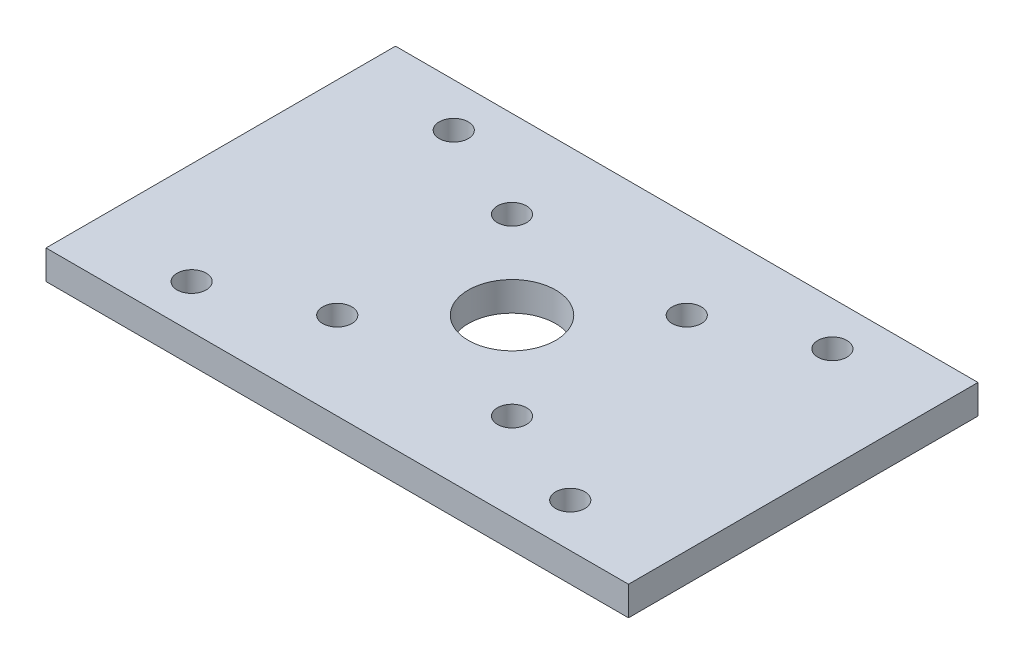
ISO-10303-21;
HEADER;
FILE_DESCRIPTION(('STEP AP214'),'2;1');
FILE_NAME('part.step','',(''),(''),'','','');
FILE_SCHEMA(('AUTOMOTIVE_DESIGN { 1 0 10303 214 1 1 1 1 }'));
ENDSEC;
DATA;
#1=APPLICATION_CONTEXT('core data for automotive mechanical design processes');
#2=APPLICATION_PROTOCOL_DEFINITION('international standard','automotive_design',2000,#1);
#3=PRODUCT_CONTEXT('',#1,'mechanical');
#4=PRODUCT('Part','Part','',(#3));
#5=PRODUCT_RELATED_PRODUCT_CATEGORY('part','',(#4));
#6=PRODUCT_DEFINITION_FORMATION('','',#4);
#7=PRODUCT_DEFINITION_CONTEXT('part definition',#1,'design');
#8=PRODUCT_DEFINITION('design','',#6,#7);
#9=PRODUCT_DEFINITION_SHAPE('','',#8);
#10=(LENGTH_UNIT() NAMED_UNIT(*) SI_UNIT(.MILLI.,.METRE.));
#11=(NAMED_UNIT(*) PLANE_ANGLE_UNIT() SI_UNIT($,.RADIAN.));
#12=(NAMED_UNIT(*) SI_UNIT($,.STERADIAN.) SOLID_ANGLE_UNIT());
#13=UNCERTAINTY_MEASURE_WITH_UNIT(LENGTH_MEASURE(1.E-05),#10,'distance_accuracy_value','');
#14=(GEOMETRIC_REPRESENTATION_CONTEXT(3) GLOBAL_UNCERTAINTY_ASSIGNED_CONTEXT((#13)) GLOBAL_UNIT_ASSIGNED_CONTEXT((#10,
#11,#12)) REPRESENTATION_CONTEXT('',''));
#15=CARTESIAN_POINT('',(0.,0.,0.));
#16=DIRECTION('',(0.,0.,1.));
#17=DIRECTION('',(1.,0.,0.));
#18=AXIS2_PLACEMENT_3D('',#15,#16,#17);
#19=CARTESIAN_POINT('',(63.5,6.35,38.1));
#20=DIRECTION('',(-1.,0.,0.));
#21=DIRECTION('',(0.,0.,1.));
#22=AXIS2_PLACEMENT_3D('',#19,#20,#21);
#23=PLANE('',#22);
#24=DIRECTION('',(0.,0.,-1.));
#25=VECTOR('',#24,1.);
#26=CARTESIAN_POINT('',(63.5,0.,38.1));
#27=LINE('',#26,#25);
#28=CARTESIAN_POINT('',(63.5,0.,38.1));
#29=VERTEX_POINT('',#28);
#30=CARTESIAN_POINT('',(63.5,0.,-38.1));
#31=VERTEX_POINT('',#30);
#32=EDGE_CURVE('E96',#29,#31,#27,.T.);
#33=ORIENTED_EDGE('',*,*,#32,.T.);
#34=DIRECTION('',(0.,-1.,0.));
#35=VECTOR('',#34,1.);
#36=CARTESIAN_POINT('',(63.5,6.35,-38.1));
#37=LINE('',#36,#35);
#38=CARTESIAN_POINT('',(63.5,6.35,-38.1));
#39=VERTEX_POINT('',#38);
#40=EDGE_CURVE('E11',#39,#31,#37,.T.);
#41=ORIENTED_EDGE('',*,*,#40,.F.);
#42=DIRECTION('',(0.,0.,-1.));
#43=VECTOR('',#42,1.);
#44=CARTESIAN_POINT('',(63.5,6.35,38.1));
#45=LINE('',#44,#43);
#46=CARTESIAN_POINT('',(63.5,6.35,38.1));
#47=VERTEX_POINT('',#46);
#48=EDGE_CURVE('E84',#47,#39,#45,.T.);
#49=ORIENTED_EDGE('',*,*,#48,.F.);
#50=DIRECTION('',(0.,-1.,0.));
#51=VECTOR('',#50,1.);
#52=CARTESIAN_POINT('',(63.5,6.35,38.1));
#53=LINE('',#52,#51);
#54=EDGE_CURVE('E92',#47,#29,#53,.T.);
#55=ORIENTED_EDGE('',*,*,#54,.T.);
#56=EDGE_LOOP('',(#33,#41,#49,#55));
#57=FACE_BOUND('',#56,.T.);
#58=ADVANCED_FACE('F33',(#57),#23,.F.);
#59=CARTESIAN_POINT('',(-63.5,6.35,-38.1));
#60=DIRECTION('',(0.,0.,1.));
#61=DIRECTION('',(1.,0.,0.));
#62=AXIS2_PLACEMENT_3D('',#59,#60,#61);
#63=PLANE('',#62);
#64=DIRECTION('',(-1.,0.,0.));
#65=VECTOR('',#64,1.);
#66=CARTESIAN_POINT('',(-63.5,0.,-38.1));
#67=LINE('',#66,#65);
#68=CARTESIAN_POINT('',(-63.5,0.,-38.1));
#69=VERTEX_POINT('',#68);
#70=EDGE_CURVE('E88',#31,#69,#67,.T.);
#71=ORIENTED_EDGE('',*,*,#70,.T.);
#72=DIRECTION('',(0.,-1.,0.));
#73=VECTOR('',#72,1.);
#74=CARTESIAN_POINT('',(-63.5,6.35,-38.1));
#75=LINE('',#74,#73);
#76=CARTESIAN_POINT('',(-63.5,6.35,-38.1));
#77=VERTEX_POINT('',#76);
#78=EDGE_CURVE('E41',#77,#69,#75,.T.);
#79=ORIENTED_EDGE('',*,*,#78,.F.);
#80=DIRECTION('',(-1.,0.,0.));
#81=VECTOR('',#80,1.);
#82=CARTESIAN_POINT('',(-63.5,6.35,-38.1));
#83=LINE('',#82,#81);
#84=EDGE_CURVE('E79',#39,#77,#83,.T.);
#85=ORIENTED_EDGE('',*,*,#84,.F.);
#86=ORIENTED_EDGE('',*,*,#40,.T.);
#87=EDGE_LOOP('',(#71,#79,#85,#86));
#88=FACE_BOUND('',#87,.T.);
#89=ADVANCED_FACE('F87',(#88),#63,.F.);
#90=CARTESIAN_POINT('',(-63.5,6.35,38.1));
#91=DIRECTION('',(1.,0.,0.));
#92=DIRECTION('',(0.,0.,-1.));
#93=AXIS2_PLACEMENT_3D('',#90,#91,#92);
#94=PLANE('',#93);
#95=DIRECTION('',(0.,0.,1.));
#96=VECTOR('',#95,1.);
#97=CARTESIAN_POINT('',(-63.5,0.,38.1));
#98=LINE('',#97,#96);
#99=CARTESIAN_POINT('',(-63.5,0.,38.1));
#100=VERTEX_POINT('',#99);
#101=EDGE_CURVE('E66',#69,#100,#98,.T.);
#102=ORIENTED_EDGE('',*,*,#101,.T.);
#103=DIRECTION('',(0.,-1.,0.));
#104=VECTOR('',#103,1.);
#105=CARTESIAN_POINT('',(-63.5,6.35,38.1));
#106=LINE('',#105,#104);
#107=CARTESIAN_POINT('',(-63.5,6.35,38.1));
#108=VERTEX_POINT('',#107);
#109=EDGE_CURVE('E89',#108,#100,#106,.T.);
#110=ORIENTED_EDGE('',*,*,#109,.F.);
#111=DIRECTION('',(0.,0.,1.));
#112=VECTOR('',#111,1.);
#113=CARTESIAN_POINT('',(-63.5,6.35,38.1));
#114=LINE('',#113,#112);
#115=EDGE_CURVE('E82',#77,#108,#114,.T.);
#116=ORIENTED_EDGE('',*,*,#115,.F.);
#117=ORIENTED_EDGE('',*,*,#78,.T.);
#118=EDGE_LOOP('',(#102,#110,#116,#117));
#119=FACE_BOUND('',#118,.T.);
#120=ADVANCED_FACE('F90',(#119),#94,.F.);
#121=CARTESIAN_POINT('',(-63.5,6.35,38.1));
#122=DIRECTION('',(0.,0.,-1.));
#123=DIRECTION('',(-1.,0.,0.));
#124=AXIS2_PLACEMENT_3D('',#121,#122,#123);
#125=PLANE('',#124);
#126=DIRECTION('',(1.,0.,0.));
#127=VECTOR('',#126,1.);
#128=CARTESIAN_POINT('',(-63.5,0.,38.1));
#129=LINE('',#128,#127);
#130=EDGE_CURVE('E72',#100,#29,#129,.T.);
#131=ORIENTED_EDGE('',*,*,#130,.T.);
#132=ORIENTED_EDGE('',*,*,#54,.F.);
#133=DIRECTION('',(1.,0.,0.));
#134=VECTOR('',#133,1.);
#135=CARTESIAN_POINT('',(-63.5,6.35,38.1));
#136=LINE('',#135,#134);
#137=EDGE_CURVE('E49',#108,#47,#136,.T.);
#138=ORIENTED_EDGE('',*,*,#137,.F.);
#139=ORIENTED_EDGE('',*,*,#109,.T.);
#140=EDGE_LOOP('',(#131,#132,#138,#139));
#141=FACE_BOUND('',#140,.T.);
#142=ADVANCED_FACE('F104',(#141),#125,.F.);
#143=CARTESIAN_POINT('',(0.,6.35,0.));
#144=DIRECTION('',(0.,-1.,0.));
#145=DIRECTION('',(0.,0.,-1.));
#146=AXIS2_PLACEMENT_3D('',#143,#144,#145);
#147=PLANE('',#146);
#148=CARTESIAN_POINT('',(0.,6.35,0.));
#149=DIRECTION('',(0.,1.,0.));
#150=DIRECTION('',(0.,0.,1.));
#151=AXIS2_PLACEMENT_3D('',#148,#149,#150);
#152=CIRCLE('',#151,9.525);
#153=CARTESIAN_POINT('',(0.,6.35,9.52499999999999));
#154=VERTEX_POINT('',#153);
#155=EDGE_CURVE('E158',#154,#154,#152,.T.);
#156=ORIENTED_EDGE('',*,*,#155,.F.);
#157=EDGE_LOOP('',(#156));
#158=FACE_BOUND('',#157,.T.);
#159=CARTESIAN_POINT('',(-19.05,6.35,19.05));
#160=DIRECTION('',(0.,1.,0.));
#161=DIRECTION('',(0.,0.,1.));
#162=AXIS2_PLACEMENT_3D('',#159,#160,#161);
#163=CIRCLE('',#162,3.175);
#164=CARTESIAN_POINT('',(-19.05,6.35,22.225));
#165=VERTEX_POINT('',#164);
#166=EDGE_CURVE('E152',#165,#165,#163,.T.);
#167=ORIENTED_EDGE('',*,*,#166,.F.);
#168=EDGE_LOOP('',(#167));
#169=FACE_BOUND('',#168,.T.);
#170=CARTESIAN_POINT('',(19.05,6.35,19.05));
#171=DIRECTION('',(0.,1.,0.));
#172=DIRECTION('',(0.,0.,1.));
#173=AXIS2_PLACEMENT_3D('',#170,#171,#172);
#174=CIRCLE('',#173,3.175);
#175=CARTESIAN_POINT('',(19.05,6.35,22.225));
#176=VERTEX_POINT('',#175);
#177=EDGE_CURVE('E146',#176,#176,#174,.T.);
#178=ORIENTED_EDGE('',*,*,#177,.F.);
#179=EDGE_LOOP('',(#178));
#180=FACE_BOUND('',#179,.T.);
#181=CARTESIAN_POINT('',(19.05,6.35,-19.05));
#182=DIRECTION('',(0.,1.,0.));
#183=DIRECTION('',(0.,0.,1.));
#184=AXIS2_PLACEMENT_3D('',#181,#182,#183);
#185=CIRCLE('',#184,3.175);
#186=CARTESIAN_POINT('',(19.05,6.35,-15.875));
#187=VERTEX_POINT('',#186);
#188=EDGE_CURVE('E140',#187,#187,#185,.T.);
#189=ORIENTED_EDGE('',*,*,#188,.F.);
#190=EDGE_LOOP('',(#189));
#191=FACE_BOUND('',#190,.T.);
#192=CARTESIAN_POINT('',(-19.05,6.35,-19.05));
#193=DIRECTION('',(0.,1.,0.));
#194=DIRECTION('',(0.,0.,1.));
#195=AXIS2_PLACEMENT_3D('',#192,#193,#194);
#196=CIRCLE('',#195,3.175);
#197=CARTESIAN_POINT('',(-19.05,6.35,-15.875));
#198=VERTEX_POINT('',#197);
#199=EDGE_CURVE('E134',#198,#198,#196,.T.);
#200=ORIENTED_EDGE('',*,*,#199,.F.);
#201=EDGE_LOOP('',(#200));
#202=FACE_BOUND('',#201,.T.);
#203=CARTESIAN_POINT('',(-41.275,6.35,28.575));
#204=DIRECTION('',(0.,1.,0.));
#205=DIRECTION('',(0.,0.,1.));
#206=AXIS2_PLACEMENT_3D('',#203,#204,#205);
#207=CIRCLE('',#206,3.175);
#208=CARTESIAN_POINT('',(-41.275,6.35,31.75));
#209=VERTEX_POINT('',#208);
#210=EDGE_CURVE('E128',#209,#209,#207,.T.);
#211=ORIENTED_EDGE('',*,*,#210,.F.);
#212=EDGE_LOOP('',(#211));
#213=FACE_BOUND('',#212,.T.);
#214=CARTESIAN_POINT('',(41.275,6.35,28.575));
#215=DIRECTION('',(0.,1.,0.));
#216=DIRECTION('',(0.,0.,1.));
#217=AXIS2_PLACEMENT_3D('',#214,#215,#216);
#218=CIRCLE('',#217,3.175);
#219=CARTESIAN_POINT('',(41.275,6.35,31.75));
#220=VERTEX_POINT('',#219);
#221=EDGE_CURVE('E122',#220,#220,#218,.T.);
#222=ORIENTED_EDGE('',*,*,#221,.F.);
#223=EDGE_LOOP('',(#222));
#224=FACE_BOUND('',#223,.T.);
#225=CARTESIAN_POINT('',(41.275,6.35,-28.575));
#226=DIRECTION('',(0.,1.,0.));
#227=DIRECTION('',(0.,0.,1.));
#228=AXIS2_PLACEMENT_3D('',#225,#226,#227);
#229=CIRCLE('',#228,3.175);
#230=CARTESIAN_POINT('',(41.275,6.35,-25.4));
#231=VERTEX_POINT('',#230);
#232=EDGE_CURVE('E116',#231,#231,#229,.T.);
#233=ORIENTED_EDGE('',*,*,#232,.F.);
#234=EDGE_LOOP('',(#233));
#235=FACE_BOUND('',#234,.T.);
#236=CARTESIAN_POINT('',(-41.275,6.35,-28.575));
#237=DIRECTION('',(0.,1.,0.));
#238=DIRECTION('',(0.,0.,1.));
#239=AXIS2_PLACEMENT_3D('',#236,#237,#238);
#240=CIRCLE('',#239,3.175);
#241=CARTESIAN_POINT('',(-41.275,6.35,-25.4));
#242=VERTEX_POINT('',#241);
#243=EDGE_CURVE('E110',#242,#242,#240,.T.);
#244=ORIENTED_EDGE('',*,*,#243,.F.);
#245=EDGE_LOOP('',(#244));
#246=FACE_BOUND('',#245,.T.);
#247=ORIENTED_EDGE('',*,*,#48,.T.);
#248=ORIENTED_EDGE('',*,*,#84,.T.);
#249=ORIENTED_EDGE('',*,*,#115,.T.);
#250=ORIENTED_EDGE('',*,*,#137,.T.);
#251=EDGE_LOOP('',(#247,#248,#249,#250));
#252=FACE_BOUND('',#251,.T.);
#253=ADVANCED_FACE('F80',(#158,#169,#180,#191,#202,#213,#224,#235,#246,#252),#147,.F.);
#254=CARTESIAN_POINT('',(0.,0.,0.));
#255=DIRECTION('',(0.,-1.,0.));
#256=DIRECTION('',(0.,0.,-1.));
#257=AXIS2_PLACEMENT_3D('',#254,#255,#256);
#258=PLANE('',#257);
#259=CARTESIAN_POINT('',(0.,0.,0.));
#260=DIRECTION('',(0.,1.,0.));
#261=DIRECTION('',(0.,0.,1.));
#262=AXIS2_PLACEMENT_3D('',#259,#260,#261);
#263=CIRCLE('',#262,9.525);
#264=CARTESIAN_POINT('',(0.,0.,9.52499999999999));
#265=VERTEX_POINT('',#264);
#266=EDGE_CURVE('E155',#265,#265,#263,.T.);
#267=ORIENTED_EDGE('',*,*,#266,.T.);
#268=EDGE_LOOP('',(#267));
#269=FACE_BOUND('',#268,.T.);
#270=CARTESIAN_POINT('',(-19.05,0.,19.05));
#271=DIRECTION('',(0.,1.,0.));
#272=DIRECTION('',(0.,0.,1.));
#273=AXIS2_PLACEMENT_3D('',#270,#271,#272);
#274=CIRCLE('',#273,3.175);
#275=CARTESIAN_POINT('',(-19.05,0.,22.225));
#276=VERTEX_POINT('',#275);
#277=EDGE_CURVE('E149',#276,#276,#274,.T.);
#278=ORIENTED_EDGE('',*,*,#277,.T.);
#279=EDGE_LOOP('',(#278));
#280=FACE_BOUND('',#279,.T.);
#281=CARTESIAN_POINT('',(19.05,0.,19.05));
#282=DIRECTION('',(0.,1.,0.));
#283=DIRECTION('',(0.,0.,1.));
#284=AXIS2_PLACEMENT_3D('',#281,#282,#283);
#285=CIRCLE('',#284,3.175);
#286=CARTESIAN_POINT('',(19.05,0.,22.225));
#287=VERTEX_POINT('',#286);
#288=EDGE_CURVE('E143',#287,#287,#285,.T.);
#289=ORIENTED_EDGE('',*,*,#288,.T.);
#290=EDGE_LOOP('',(#289));
#291=FACE_BOUND('',#290,.T.);
#292=CARTESIAN_POINT('',(19.05,0.,-19.05));
#293=DIRECTION('',(0.,1.,0.));
#294=DIRECTION('',(0.,0.,1.));
#295=AXIS2_PLACEMENT_3D('',#292,#293,#294);
#296=CIRCLE('',#295,3.175);
#297=CARTESIAN_POINT('',(19.05,0.,-15.875));
#298=VERTEX_POINT('',#297);
#299=EDGE_CURVE('E137',#298,#298,#296,.T.);
#300=ORIENTED_EDGE('',*,*,#299,.T.);
#301=EDGE_LOOP('',(#300));
#302=FACE_BOUND('',#301,.T.);
#303=CARTESIAN_POINT('',(-19.05,0.,-19.05));
#304=DIRECTION('',(0.,1.,0.));
#305=DIRECTION('',(0.,0.,1.));
#306=AXIS2_PLACEMENT_3D('',#303,#304,#305);
#307=CIRCLE('',#306,3.175);
#308=CARTESIAN_POINT('',(-19.05,0.,-15.875));
#309=VERTEX_POINT('',#308);
#310=EDGE_CURVE('E131',#309,#309,#307,.T.);
#311=ORIENTED_EDGE('',*,*,#310,.T.);
#312=EDGE_LOOP('',(#311));
#313=FACE_BOUND('',#312,.T.);
#314=CARTESIAN_POINT('',(-41.275,0.,28.575));
#315=DIRECTION('',(0.,1.,0.));
#316=DIRECTION('',(0.,0.,1.));
#317=AXIS2_PLACEMENT_3D('',#314,#315,#316);
#318=CIRCLE('',#317,3.175);
#319=CARTESIAN_POINT('',(-41.275,0.,31.75));
#320=VERTEX_POINT('',#319);
#321=EDGE_CURVE('E125',#320,#320,#318,.T.);
#322=ORIENTED_EDGE('',*,*,#321,.T.);
#323=EDGE_LOOP('',(#322));
#324=FACE_BOUND('',#323,.T.);
#325=CARTESIAN_POINT('',(41.275,0.,28.575));
#326=DIRECTION('',(0.,1.,0.));
#327=DIRECTION('',(0.,0.,1.));
#328=AXIS2_PLACEMENT_3D('',#325,#326,#327);
#329=CIRCLE('',#328,3.175);
#330=CARTESIAN_POINT('',(41.275,0.,31.75));
#331=VERTEX_POINT('',#330);
#332=EDGE_CURVE('E119',#331,#331,#329,.T.);
#333=ORIENTED_EDGE('',*,*,#332,.T.);
#334=EDGE_LOOP('',(#333));
#335=FACE_BOUND('',#334,.T.);
#336=CARTESIAN_POINT('',(41.275,0.,-28.575));
#337=DIRECTION('',(0.,1.,0.));
#338=DIRECTION('',(0.,0.,1.));
#339=AXIS2_PLACEMENT_3D('',#336,#337,#338);
#340=CIRCLE('',#339,3.175);
#341=CARTESIAN_POINT('',(41.275,0.,-25.4));
#342=VERTEX_POINT('',#341);
#343=EDGE_CURVE('E113',#342,#342,#340,.T.);
#344=ORIENTED_EDGE('',*,*,#343,.T.);
#345=EDGE_LOOP('',(#344));
#346=FACE_BOUND('',#345,.T.);
#347=CARTESIAN_POINT('',(-41.275,0.,-28.575));
#348=DIRECTION('',(0.,1.,0.));
#349=DIRECTION('',(0.,0.,1.));
#350=AXIS2_PLACEMENT_3D('',#347,#348,#349);
#351=CIRCLE('',#350,3.175);
#352=CARTESIAN_POINT('',(-41.275,0.,-25.4));
#353=VERTEX_POINT('',#352);
#354=EDGE_CURVE('E99',#353,#353,#351,.T.);
#355=ORIENTED_EDGE('',*,*,#354,.T.);
#356=EDGE_LOOP('',(#355));
#357=FACE_BOUND('',#356,.T.);
#358=ORIENTED_EDGE('',*,*,#32,.F.);
#359=ORIENTED_EDGE('',*,*,#130,.F.);
#360=ORIENTED_EDGE('',*,*,#101,.F.);
#361=ORIENTED_EDGE('',*,*,#70,.F.);
#362=EDGE_LOOP('',(#358,#359,#360,#361));
#363=FACE_BOUND('',#362,.T.);
#364=ADVANCED_FACE('F107',(#269,#280,#291,#302,#313,#324,#335,#346,#357,#363),#258,.T.);
#365=CARTESIAN_POINT('',(-41.275,0.,-28.575));
#366=DIRECTION('',(0.,1.,0.));
#367=DIRECTION('',(0.,0.,1.));
#368=AXIS2_PLACEMENT_3D('',#365,#366,#367);
#369=CYLINDRICAL_SURFACE('',#368,3.175);
#370=ORIENTED_EDGE('',*,*,#354,.F.);
#371=EDGE_LOOP('',(#370));
#372=FACE_BOUND('',#371,.T.);
#373=ORIENTED_EDGE('',*,*,#243,.T.);
#374=EDGE_LOOP('',(#373));
#375=FACE_BOUND('',#374,.T.);
#376=ADVANCED_FACE('F192',(#372,#375),#369,.F.);
#377=CARTESIAN_POINT('',(41.275,0.,-28.575));
#378=DIRECTION('',(0.,1.,0.));
#379=DIRECTION('',(0.,0.,1.));
#380=AXIS2_PLACEMENT_3D('',#377,#378,#379);
#381=CYLINDRICAL_SURFACE('',#380,3.175);
#382=ORIENTED_EDGE('',*,*,#343,.F.);
#383=EDGE_LOOP('',(#382));
#384=FACE_BOUND('',#383,.T.);
#385=ORIENTED_EDGE('',*,*,#232,.T.);
#386=EDGE_LOOP('',(#385));
#387=FACE_BOUND('',#386,.T.);
#388=ADVANCED_FACE('F194',(#384,#387),#381,.F.);
#389=CARTESIAN_POINT('',(41.275,0.,28.575));
#390=DIRECTION('',(0.,1.,0.));
#391=DIRECTION('',(0.,0.,1.));
#392=AXIS2_PLACEMENT_3D('',#389,#390,#391);
#393=CYLINDRICAL_SURFACE('',#392,3.175);
#394=ORIENTED_EDGE('',*,*,#332,.F.);
#395=EDGE_LOOP('',(#394));
#396=FACE_BOUND('',#395,.T.);
#397=ORIENTED_EDGE('',*,*,#221,.T.);
#398=EDGE_LOOP('',(#397));
#399=FACE_BOUND('',#398,.T.);
#400=ADVANCED_FACE('F201',(#396,#399),#393,.F.);
#401=CARTESIAN_POINT('',(-41.275,0.,28.575));
#402=DIRECTION('',(0.,1.,0.));
#403=DIRECTION('',(0.,0.,1.));
#404=AXIS2_PLACEMENT_3D('',#401,#402,#403);
#405=CYLINDRICAL_SURFACE('',#404,3.175);
#406=ORIENTED_EDGE('',*,*,#321,.F.);
#407=EDGE_LOOP('',(#406));
#408=FACE_BOUND('',#407,.T.);
#409=ORIENTED_EDGE('',*,*,#210,.T.);
#410=EDGE_LOOP('',(#409));
#411=FACE_BOUND('',#410,.T.);
#412=ADVANCED_FACE('F249',(#408,#411),#405,.F.);
#413=CARTESIAN_POINT('',(-19.05,0.,-19.05));
#414=DIRECTION('',(0.,1.,0.));
#415=DIRECTION('',(0.,0.,1.));
#416=AXIS2_PLACEMENT_3D('',#413,#414,#415);
#417=CYLINDRICAL_SURFACE('',#416,3.175);
#418=ORIENTED_EDGE('',*,*,#310,.F.);
#419=EDGE_LOOP('',(#418));
#420=FACE_BOUND('',#419,.T.);
#421=ORIENTED_EDGE('',*,*,#199,.T.);
#422=EDGE_LOOP('',(#421));
#423=FACE_BOUND('',#422,.T.);
#424=ADVANCED_FACE('F259',(#420,#423),#417,.F.);
#425=CARTESIAN_POINT('',(19.05,0.,-19.05));
#426=DIRECTION('',(0.,1.,0.));
#427=DIRECTION('',(0.,0.,1.));
#428=AXIS2_PLACEMENT_3D('',#425,#426,#427);
#429=CYLINDRICAL_SURFACE('',#428,3.175);
#430=ORIENTED_EDGE('',*,*,#299,.F.);
#431=EDGE_LOOP('',(#430));
#432=FACE_BOUND('',#431,.T.);
#433=ORIENTED_EDGE('',*,*,#188,.T.);
#434=EDGE_LOOP('',(#433));
#435=FACE_BOUND('',#434,.T.);
#436=ADVANCED_FACE('F269',(#432,#435),#429,.F.);
#437=CARTESIAN_POINT('',(19.05,0.,19.05));
#438=DIRECTION('',(0.,1.,0.));
#439=DIRECTION('',(0.,0.,1.));
#440=AXIS2_PLACEMENT_3D('',#437,#438,#439);
#441=CYLINDRICAL_SURFACE('',#440,3.175);
#442=ORIENTED_EDGE('',*,*,#288,.F.);
#443=EDGE_LOOP('',(#442));
#444=FACE_BOUND('',#443,.T.);
#445=ORIENTED_EDGE('',*,*,#177,.T.);
#446=EDGE_LOOP('',(#445));
#447=FACE_BOUND('',#446,.T.);
#448=ADVANCED_FACE('F279',(#444,#447),#441,.F.);
#449=CARTESIAN_POINT('',(-19.05,0.,19.05));
#450=DIRECTION('',(0.,1.,0.));
#451=DIRECTION('',(0.,0.,1.));
#452=AXIS2_PLACEMENT_3D('',#449,#450,#451);
#453=CYLINDRICAL_SURFACE('',#452,3.175);
#454=ORIENTED_EDGE('',*,*,#277,.F.);
#455=EDGE_LOOP('',(#454));
#456=FACE_BOUND('',#455,.T.);
#457=ORIENTED_EDGE('',*,*,#166,.T.);
#458=EDGE_LOOP('',(#457));
#459=FACE_BOUND('',#458,.T.);
#460=ADVANCED_FACE('F169',(#456,#459),#453,.F.);
#461=CARTESIAN_POINT('',(0.,0.,0.));
#462=DIRECTION('',(0.,1.,0.));
#463=DIRECTION('',(0.,0.,1.));
#464=AXIS2_PLACEMENT_3D('',#461,#462,#463);
#465=CYLINDRICAL_SURFACE('',#464,9.525);
#466=ORIENTED_EDGE('',*,*,#266,.F.);
#467=EDGE_LOOP('',(#466));
#468=FACE_BOUND('',#467,.T.);
#469=ORIENTED_EDGE('',*,*,#155,.T.);
#470=EDGE_LOOP('',(#469));
#471=FACE_BOUND('',#470,.T.);
#472=ADVANCED_FACE('F166',(#468,#471),#465,.F.);
#473=CLOSED_SHELL('',(#58,#89,#120,#142,#253,#364,#376,#388,#400,#412,#424,#436,#448,#460,#472));
#474=MANIFOLD_SOLID_BREP('B2',#473);
#475=ADVANCED_BREP_SHAPE_REPRESENTATION('',(#18,#474),#14);
#476=SHAPE_DEFINITION_REPRESENTATION(#9,#475);
ENDSEC;
END-ISO-10303-21;
